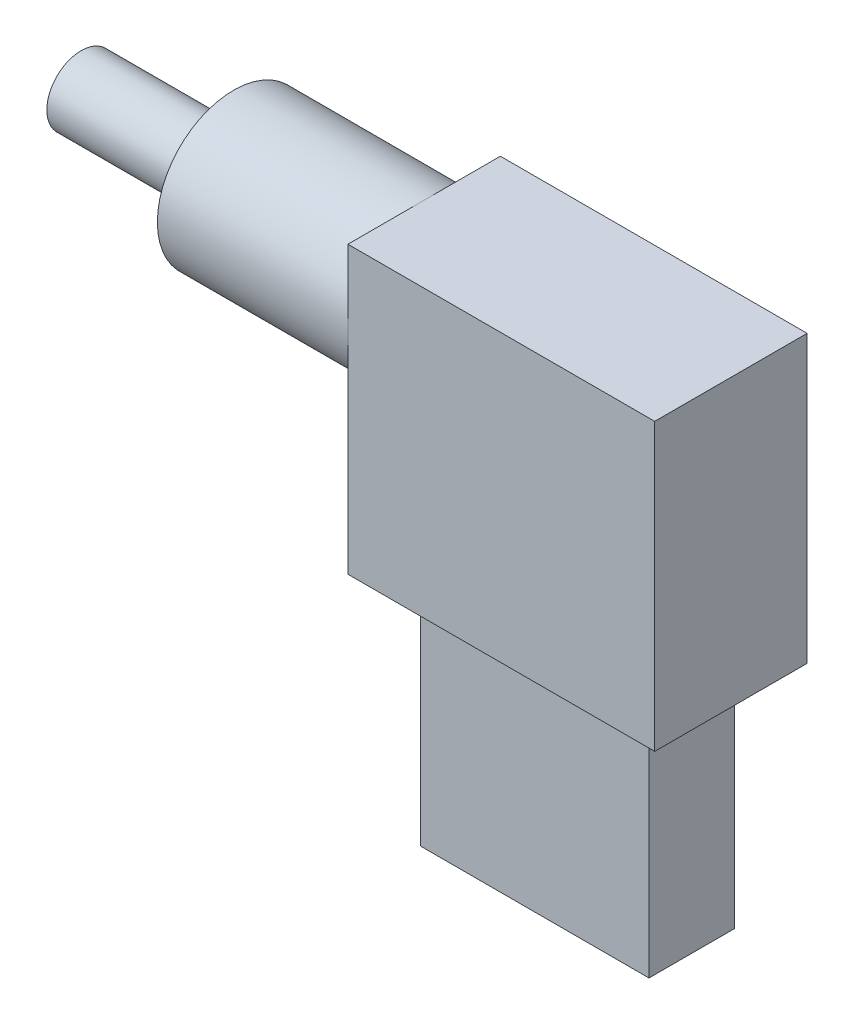
ISO-10303-21;
HEADER;
FILE_DESCRIPTION(('STEP AP214'),'2;1');
FILE_NAME('part.step','',(''),(''),'','','');
FILE_SCHEMA(('AUTOMOTIVE_DESIGN { 1 0 10303 214 1 1 1 1 }'));
ENDSEC;
DATA;
#1=APPLICATION_CONTEXT('core data for automotive mechanical design processes');
#2=APPLICATION_PROTOCOL_DEFINITION('international standard','automotive_design',2000,#1);
#3=PRODUCT_CONTEXT('',#1,'mechanical');
#4=PRODUCT('Part','Part','',(#3));
#5=PRODUCT_RELATED_PRODUCT_CATEGORY('part','',(#4));
#6=PRODUCT_DEFINITION_FORMATION('','',#4);
#7=PRODUCT_DEFINITION_CONTEXT('part definition',#1,'design');
#8=PRODUCT_DEFINITION('design','',#6,#7);
#9=PRODUCT_DEFINITION_SHAPE('','',#8);
#10=(LENGTH_UNIT() NAMED_UNIT(*) SI_UNIT(.MILLI.,.METRE.));
#11=(NAMED_UNIT(*) PLANE_ANGLE_UNIT() SI_UNIT($,.RADIAN.));
#12=(NAMED_UNIT(*) SI_UNIT($,.STERADIAN.) SOLID_ANGLE_UNIT());
#13=UNCERTAINTY_MEASURE_WITH_UNIT(LENGTH_MEASURE(1.E-05),#10,'distance_accuracy_value','');
#14=(GEOMETRIC_REPRESENTATION_CONTEXT(3) GLOBAL_UNCERTAINTY_ASSIGNED_CONTEXT((#13)) GLOBAL_UNIT_ASSIGNED_CONTEXT((#10,
#11,#12)) REPRESENTATION_CONTEXT('',''));
#15=CARTESIAN_POINT('',(0.,0.,0.));
#16=DIRECTION('',(0.,0.,1.));
#17=DIRECTION('',(1.,0.,0.));
#18=AXIS2_PLACEMENT_3D('',#15,#16,#17);
#19=CARTESIAN_POINT('',(-8.05,27.2,-4.));
#20=DIRECTION('',(1.,0.,0.));
#21=DIRECTION('',(0.,0.,-1.));
#22=AXIS2_PLACEMENT_3D('',#19,#20,#21);
#23=PLANE('',#22);
#24=CARTESIAN_POINT('',(-8.05,23.2,0.));
#25=DIRECTION('',(-1.,0.,0.));
#26=DIRECTION('',(0.,0.,1.));
#27=AXIS2_PLACEMENT_3D('',#24,#25,#26);
#28=CIRCLE('',#27,4.);
#29=CARTESIAN_POINT('',(-8.05,23.2,4.));
#30=VERTEX_POINT('',#29);
#31=CARTESIAN_POINT('',(-8.05,27.2,0.));
#32=VERTEX_POINT('',#31);
#33=EDGE_CURVE('E153',#30,#32,#28,.T.);
#34=ORIENTED_EDGE('',*,*,#33,.F.);
#35=DIRECTION('',(0.,-1.,0.));
#36=VECTOR('',#35,1.);
#37=CARTESIAN_POINT('',(-8.05,27.2,4.));
#38=LINE('',#37,#36);
#39=CARTESIAN_POINT('',(-8.05,27.2,4.));
#40=VERTEX_POINT('',#39);
#41=EDGE_CURVE('E137',#40,#30,#38,.T.);
#42=ORIENTED_EDGE('',*,*,#41,.F.);
#43=DIRECTION('',(0.,0.,1.));
#44=VECTOR('',#43,1.);
#45=CARTESIAN_POINT('',(-8.05,27.2,-4.));
#46=LINE('',#45,#44);
#47=EDGE_CURVE('E154',#32,#40,#46,.T.);
#48=ORIENTED_EDGE('',*,*,#47,.F.);
#49=EDGE_LOOP('',(#34,#42,#48));
#50=FACE_BOUND('',#49,.T.);
#51=ADVANCED_FACE('F35',(#50),#23,.F.);
#52=CARTESIAN_POINT('',(-8.05,23.2,-4.));
#53=VERTEX_POINT('',#52);
#54=EDGE_CURVE('E44',#32,#53,#28,.T.);
#55=ORIENTED_EDGE('',*,*,#54,.F.);
#56=CARTESIAN_POINT('',(-8.05,27.2,-4.));
#57=VERTEX_POINT('',#56);
#58=EDGE_CURVE('E166',#57,#32,#46,.T.);
#59=ORIENTED_EDGE('',*,*,#58,.F.);
#60=DIRECTION('',(0.,-1.,0.));
#61=VECTOR('',#60,1.);
#62=CARTESIAN_POINT('',(-8.05,27.2,-4.));
#63=LINE('',#62,#61);
#64=EDGE_CURVE('E182',#57,#53,#63,.T.);
#65=ORIENTED_EDGE('',*,*,#64,.T.);
#66=EDGE_LOOP('',(#55,#59,#65));
#67=FACE_BOUND('',#66,.T.);
#68=ADVANCED_FACE('F278',(#67),#23,.F.);
#69=CARTESIAN_POINT('',(-5.7,12.2,0.));
#70=DIRECTION('',(1.,0.,0.));
#71=DIRECTION('',(0.,0.,-1.));
#72=AXIS2_PLACEMENT_3D('',#69,#70,#71);
#73=PLANE('',#72);
#74=DIRECTION('',(0.,0.,1.));
#75=VECTOR('',#74,1.);
#76=CARTESIAN_POINT('',(-5.7,0.,0.));
#77=LINE('',#76,#75);
#78=CARTESIAN_POINT('',(-5.7,0.,-1.95));
#79=VERTEX_POINT('',#78);
#80=CARTESIAN_POINT('',(-5.7,0.,-0.0499999999999997));
#81=VERTEX_POINT('',#80);
#82=EDGE_CURVE('E222',#79,#81,#77,.T.);
#83=ORIENTED_EDGE('',*,*,#82,.F.);
#84=DIRECTION('',(0.,-1.,0.));
#85=VECTOR('',#84,1.);
#86=CARTESIAN_POINT('',(-5.7,12.2,-1.95));
#87=LINE('',#86,#85);
#88=CARTESIAN_POINT('',(-5.7,12.2,-1.95));
#89=VERTEX_POINT('',#88);
#90=EDGE_CURVE('E161',#89,#79,#87,.T.);
#91=ORIENTED_EDGE('',*,*,#90,.F.);
#92=DIRECTION('',(0.,0.,1.));
#93=VECTOR('',#92,1.);
#94=CARTESIAN_POINT('',(-5.7,12.2,0.));
#95=LINE('',#94,#93);
#96=CARTESIAN_POINT('',(-5.7,12.2,-0.0499999999999997));
#97=VERTEX_POINT('',#96);
#98=EDGE_CURVE('E201',#89,#97,#95,.T.);
#99=ORIENTED_EDGE('',*,*,#98,.T.);
#100=DIRECTION('',(0.,-1.,0.));
#101=VECTOR('',#100,1.);
#102=CARTESIAN_POINT('',(-5.7,12.2,-0.0499999999999997));
#103=LINE('',#102,#101);
#104=EDGE_CURVE('E233',#97,#81,#103,.T.);
#105=ORIENTED_EDGE('',*,*,#104,.T.);
#106=EDGE_LOOP('',(#83,#91,#99,#105));
#107=FACE_BOUND('',#106,.T.);
#108=ADVANCED_FACE('F294',(#107),#73,.T.);
#109=CARTESIAN_POINT('',(0.,12.2,-1.95));
#110=DIRECTION('',(0.,0.,-1.));
#111=DIRECTION('',(-1.,0.,0.));
#112=AXIS2_PLACEMENT_3D('',#109,#110,#111);
#113=PLANE('',#112);
#114=DIRECTION('',(1.,0.,0.));
#115=VECTOR('',#114,1.);
#116=CARTESIAN_POINT('',(0.,0.,-1.95));
#117=LINE('',#116,#115);
#118=CARTESIAN_POINT('',(5.7,0.,-1.95));
#119=VERTEX_POINT('',#118);
#120=EDGE_CURVE('E225',#79,#119,#117,.T.);
#121=ORIENTED_EDGE('',*,*,#120,.T.);
#122=DIRECTION('',(0.,-1.,0.));
#123=VECTOR('',#122,1.);
#124=CARTESIAN_POINT('',(5.7,12.2,-1.95));
#125=LINE('',#124,#123);
#126=CARTESIAN_POINT('',(5.7,12.2,-1.95));
#127=VERTEX_POINT('',#126);
#128=EDGE_CURVE('E162',#127,#119,#125,.T.);
#129=ORIENTED_EDGE('',*,*,#128,.F.);
#130=DIRECTION('',(1.,0.,0.));
#131=VECTOR('',#130,1.);
#132=CARTESIAN_POINT('',(0.,12.2,-1.95));
#133=LINE('',#132,#131);
#134=EDGE_CURVE('E204',#89,#127,#133,.T.);
#135=ORIENTED_EDGE('',*,*,#134,.F.);
#136=ORIENTED_EDGE('',*,*,#90,.T.);
#137=EDGE_LOOP('',(#121,#129,#135,#136));
#138=FACE_BOUND('',#137,.T.);
#139=ADVANCED_FACE('F361',(#138),#113,.F.);
#140=CARTESIAN_POINT('',(5.7,12.2,0.));
#141=DIRECTION('',(1.,0.,0.));
#142=DIRECTION('',(0.,0.,-1.));
#143=AXIS2_PLACEMENT_3D('',#140,#141,#142);
#144=PLANE('',#143);
#145=DIRECTION('',(0.,0.,1.));
#146=VECTOR('',#145,1.);
#147=CARTESIAN_POINT('',(5.7,0.,0.));
#148=LINE('',#147,#146);
#149=CARTESIAN_POINT('',(5.7,0.,-0.0499999999999997));
#150=VERTEX_POINT('',#149);
#151=EDGE_CURVE('E228',#119,#150,#148,.T.);
#152=ORIENTED_EDGE('',*,*,#151,.T.);
#153=DIRECTION('',(0.,-1.,0.));
#154=VECTOR('',#153,1.);
#155=CARTESIAN_POINT('',(5.7,12.2,-0.0499999999999997));
#156=LINE('',#155,#154);
#157=CARTESIAN_POINT('',(5.7,12.2,-0.0499999999999997));
#158=VERTEX_POINT('',#157);
#159=EDGE_CURVE('E235',#158,#150,#156,.T.);
#160=ORIENTED_EDGE('',*,*,#159,.F.);
#161=DIRECTION('',(0.,0.,1.));
#162=VECTOR('',#161,1.);
#163=CARTESIAN_POINT('',(5.7,12.2,0.));
#164=LINE('',#163,#162);
#165=EDGE_CURVE('E206',#127,#158,#164,.T.);
#166=ORIENTED_EDGE('',*,*,#165,.F.);
#167=ORIENTED_EDGE('',*,*,#128,.T.);
#168=EDGE_LOOP('',(#152,#160,#166,#167));
#169=FACE_BOUND('',#168,.T.);
#170=ADVANCED_FACE('F371',(#169),#144,.F.);
#171=CARTESIAN_POINT('',(6.,12.2,0.));
#172=DIRECTION('',(1.,0.,0.));
#173=DIRECTION('',(0.,0.,-1.));
#174=AXIS2_PLACEMENT_3D('',#171,#172,#173);
#175=PLANE('',#174);
#176=DIRECTION('',(0.,0.,1.));
#177=VECTOR('',#176,1.);
#178=CARTESIAN_POINT('',(6.,0.,0.));
#179=LINE('',#178,#177);
#180=CARTESIAN_POINT('',(6.,0.,-2.25));
#181=VERTEX_POINT('',#180);
#182=CARTESIAN_POINT('',(6.,0.,2.25));
#183=VERTEX_POINT('',#182);
#184=EDGE_CURVE('E145',#181,#183,#179,.T.);
#185=ORIENTED_EDGE('',*,*,#184,.F.);
#186=DIRECTION('',(0.,-1.,0.));
#187=VECTOR('',#186,1.);
#188=CARTESIAN_POINT('',(6.,12.2,-2.25));
#189=LINE('',#188,#187);
#190=CARTESIAN_POINT('',(6.,12.2,-2.25));
#191=VERTEX_POINT('',#190);
#192=EDGE_CURVE('E39',#191,#181,#189,.T.);
#193=ORIENTED_EDGE('',*,*,#192,.F.);
#194=DIRECTION('',(0.,0.,1.));
#195=VECTOR('',#194,1.);
#196=CARTESIAN_POINT('',(6.,12.2,0.));
#197=LINE('',#196,#195);
#198=CARTESIAN_POINT('',(6.,12.2,2.25));
#199=VERTEX_POINT('',#198);
#200=EDGE_CURVE('E189',#191,#199,#197,.T.);
#201=ORIENTED_EDGE('',*,*,#200,.T.);
#202=DIRECTION('',(0.,-1.,0.));
#203=VECTOR('',#202,1.);
#204=CARTESIAN_POINT('',(6.,12.2,2.25));
#205=LINE('',#204,#203);
#206=EDGE_CURVE('E211',#199,#183,#205,.T.);
#207=ORIENTED_EDGE('',*,*,#206,.T.);
#208=EDGE_LOOP('',(#185,#193,#201,#207));
#209=FACE_BOUND('',#208,.T.);
#210=ADVANCED_FACE('F37',(#209),#175,.T.);
#211=CARTESIAN_POINT('',(0.,12.2,-2.25));
#212=DIRECTION('',(0.,0.,-1.));
#213=DIRECTION('',(-1.,0.,0.));
#214=AXIS2_PLACEMENT_3D('',#211,#212,#213);
#215=PLANE('',#214);
#216=DIRECTION('',(1.,0.,0.));
#217=VECTOR('',#216,1.);
#218=CARTESIAN_POINT('',(0.,0.,-2.25));
#219=LINE('',#218,#217);
#220=CARTESIAN_POINT('',(-6.,0.,-2.25));
#221=VERTEX_POINT('',#220);
#222=EDGE_CURVE('E214',#221,#181,#219,.T.);
#223=ORIENTED_EDGE('',*,*,#222,.F.);
#224=DIRECTION('',(0.,-1.,0.));
#225=VECTOR('',#224,1.);
#226=CARTESIAN_POINT('',(-6.,12.2,-2.25));
#227=LINE('',#226,#225);
#228=CARTESIAN_POINT('',(-6.,12.2,-2.25));
#229=VERTEX_POINT('',#228);
#230=EDGE_CURVE('E242',#229,#221,#227,.T.);
#231=ORIENTED_EDGE('',*,*,#230,.F.);
#232=DIRECTION('',(1.,0.,0.));
#233=VECTOR('',#232,1.);
#234=CARTESIAN_POINT('',(0.,12.2,-2.25));
#235=LINE('',#234,#233);
#236=EDGE_CURVE('E191',#229,#191,#235,.T.);
#237=ORIENTED_EDGE('',*,*,#236,.T.);
#238=ORIENTED_EDGE('',*,*,#192,.T.);
#239=EDGE_LOOP('',(#223,#231,#237,#238));
#240=FACE_BOUND('',#239,.T.);
#241=ADVANCED_FACE('F249',(#240),#215,.T.);
#242=CARTESIAN_POINT('',(-6.,12.2,0.));
#243=DIRECTION('',(1.,0.,0.));
#244=DIRECTION('',(0.,0.,-1.));
#245=AXIS2_PLACEMENT_3D('',#242,#243,#244);
#246=PLANE('',#245);
#247=DIRECTION('',(0.,0.,1.));
#248=VECTOR('',#247,1.);
#249=CARTESIAN_POINT('',(-6.,0.,0.));
#250=LINE('',#249,#248);
#251=CARTESIAN_POINT('',(-6.,0.,2.25));
#252=VERTEX_POINT('',#251);
#253=EDGE_CURVE('E217',#221,#252,#250,.T.);
#254=ORIENTED_EDGE('',*,*,#253,.T.);
#255=DIRECTION('',(0.,-1.,0.));
#256=VECTOR('',#255,1.);
#257=CARTESIAN_POINT('',(-6.,12.2,2.25));
#258=LINE('',#257,#256);
#259=CARTESIAN_POINT('',(-6.,12.2,2.25));
#260=VERTEX_POINT('',#259);
#261=EDGE_CURVE('E240',#260,#252,#258,.T.);
#262=ORIENTED_EDGE('',*,*,#261,.F.);
#263=DIRECTION('',(0.,0.,1.));
#264=VECTOR('',#263,1.);
#265=CARTESIAN_POINT('',(-6.,12.2,0.));
#266=LINE('',#265,#264);
#267=EDGE_CURVE('E195',#229,#260,#266,.T.);
#268=ORIENTED_EDGE('',*,*,#267,.F.);
#269=ORIENTED_EDGE('',*,*,#230,.T.);
#270=EDGE_LOOP('',(#254,#262,#268,#269));
#271=FACE_BOUND('',#270,.T.);
#272=ADVANCED_FACE('F258',(#271),#246,.F.);
#273=CARTESIAN_POINT('',(0.,12.2,2.25));
#274=DIRECTION('',(0.,0.,-1.));
#275=DIRECTION('',(-1.,0.,0.));
#276=AXIS2_PLACEMENT_3D('',#273,#274,#275);
#277=PLANE('',#276);
#278=DIRECTION('',(1.,0.,0.));
#279=VECTOR('',#278,1.);
#280=CARTESIAN_POINT('',(0.,0.,2.25));
#281=LINE('',#280,#279);
#282=EDGE_CURVE('E219',#252,#183,#281,.T.);
#283=ORIENTED_EDGE('',*,*,#282,.T.);
#284=ORIENTED_EDGE('',*,*,#206,.F.);
#285=DIRECTION('',(1.,0.,0.));
#286=VECTOR('',#285,1.);
#287=CARTESIAN_POINT('',(0.,12.2,2.25));
#288=LINE('',#287,#286);
#289=EDGE_CURVE('E198',#260,#199,#288,.T.);
#290=ORIENTED_EDGE('',*,*,#289,.F.);
#291=ORIENTED_EDGE('',*,*,#261,.T.);
#292=EDGE_LOOP('',(#283,#284,#290,#291));
#293=FACE_BOUND('',#292,.T.);
#294=ADVANCED_FACE('F261',(#293),#277,.F.);
#295=CARTESIAN_POINT('',(0.,12.2,-0.0499999999999997));
#296=DIRECTION('',(0.,0.,-1.));
#297=DIRECTION('',(-1.,0.,0.));
#298=AXIS2_PLACEMENT_3D('',#295,#296,#297);
#299=PLANE('',#298);
#300=DIRECTION('',(1.,0.,0.));
#301=VECTOR('',#300,1.);
#302=CARTESIAN_POINT('',(0.,0.,-0.0499999999999997));
#303=LINE('',#302,#301);
#304=EDGE_CURVE('E192',#81,#150,#303,.T.);
#305=ORIENTED_EDGE('',*,*,#304,.F.);
#306=ORIENTED_EDGE('',*,*,#104,.F.);
#307=DIRECTION('',(1.,0.,0.));
#308=VECTOR('',#307,1.);
#309=CARTESIAN_POINT('',(0.,12.2,-0.0499999999999997));
#310=LINE('',#309,#308);
#311=EDGE_CURVE('E208',#97,#158,#310,.T.);
#312=ORIENTED_EDGE('',*,*,#311,.T.);
#313=ORIENTED_EDGE('',*,*,#159,.T.);
#314=EDGE_LOOP('',(#305,#306,#312,#313));
#315=FACE_BOUND('',#314,.T.);
#316=ADVANCED_FACE('F350',(#315),#299,.T.);
#317=CARTESIAN_POINT('',(0.,0.,0.));
#318=DIRECTION('',(0.,1.,0.));
#319=DIRECTION('',(0.,0.,1.));
#320=AXIS2_PLACEMENT_3D('',#317,#318,#319);
#321=PLANE('',#320);
#322=ORIENTED_EDGE('',*,*,#184,.T.);
#323=ORIENTED_EDGE('',*,*,#282,.F.);
#324=ORIENTED_EDGE('',*,*,#253,.F.);
#325=ORIENTED_EDGE('',*,*,#222,.T.);
#326=EDGE_LOOP('',(#322,#323,#324,#325));
#327=FACE_BOUND('',#326,.T.);
#328=ORIENTED_EDGE('',*,*,#82,.T.);
#329=ORIENTED_EDGE('',*,*,#304,.T.);
#330=ORIENTED_EDGE('',*,*,#151,.F.);
#331=ORIENTED_EDGE('',*,*,#120,.F.);
#332=EDGE_LOOP('',(#328,#329,#330,#331));
#333=FACE_BOUND('',#332,.T.);
#334=ADVANCED_FACE('F256',(#327,#333),#321,.F.);
#335=CARTESIAN_POINT('',(0.,12.2,0.));
#336=DIRECTION('',(0.,1.,0.));
#337=DIRECTION('',(0.,0.,1.));
#338=AXIS2_PLACEMENT_3D('',#335,#336,#337);
#339=PLANE('',#338);
#340=ORIENTED_EDGE('',*,*,#98,.F.);
#341=ORIENTED_EDGE('',*,*,#134,.T.);
#342=ORIENTED_EDGE('',*,*,#165,.T.);
#343=ORIENTED_EDGE('',*,*,#311,.F.);
#344=EDGE_LOOP('',(#340,#341,#342,#343));
#345=FACE_BOUND('',#344,.T.);
#346=ADVANCED_FACE('F266',(#345),#339,.F.);
#347=ORIENTED_EDGE('',*,*,#200,.F.);
#348=ORIENTED_EDGE('',*,*,#236,.F.);
#349=ORIENTED_EDGE('',*,*,#267,.T.);
#350=ORIENTED_EDGE('',*,*,#289,.T.);
#351=EDGE_LOOP('',(#347,#348,#349,#350));
#352=FACE_BOUND('',#351,.T.);
#353=DIRECTION('',(0.,0.,1.));
#354=VECTOR('',#353,1.);
#355=CARTESIAN_POINT('',(-8.05,12.2,-4.));
#356=LINE('',#355,#354);
#357=CARTESIAN_POINT('',(-8.05,12.2,-4.));
#358=VERTEX_POINT('',#357);
#359=CARTESIAN_POINT('',(-8.05,12.2,4.));
#360=VERTEX_POINT('',#359);
#361=EDGE_CURVE('E150',#358,#360,#356,.T.);
#362=ORIENTED_EDGE('',*,*,#361,.F.);
#363=DIRECTION('',(-1.,0.,0.));
#364=VECTOR('',#363,1.);
#365=CARTESIAN_POINT('',(-8.05,12.2,-4.));
#366=LINE('',#365,#364);
#367=CARTESIAN_POINT('',(8.05,12.2,-4.));
#368=VERTEX_POINT('',#367);
#369=EDGE_CURVE('E179',#368,#358,#366,.T.);
#370=ORIENTED_EDGE('',*,*,#369,.F.);
#371=DIRECTION('',(0.,0.,-1.));
#372=VECTOR('',#371,1.);
#373=CARTESIAN_POINT('',(8.05,12.2,-4.));
#374=LINE('',#373,#372);
#375=CARTESIAN_POINT('',(8.05,12.2,4.));
#376=VERTEX_POINT('',#375);
#377=EDGE_CURVE('E177',#376,#368,#374,.T.);
#378=ORIENTED_EDGE('',*,*,#377,.F.);
#379=DIRECTION('',(1.,0.,0.));
#380=VECTOR('',#379,1.);
#381=CARTESIAN_POINT('',(-8.05,12.2,4.));
#382=LINE('',#381,#380);
#383=EDGE_CURVE('E175',#360,#376,#382,.T.);
#384=ORIENTED_EDGE('',*,*,#383,.F.);
#385=EDGE_LOOP('',(#362,#370,#378,#384));
#386=FACE_BOUND('',#385,.T.);
#387=ADVANCED_FACE('F263',(#352,#386),#339,.F.);
#388=EDGE_CURVE('E52',#53,#30,#28,.T.);
#389=ORIENTED_EDGE('',*,*,#388,.F.);
#390=EDGE_CURVE('E173',#53,#358,#63,.T.);
#391=ORIENTED_EDGE('',*,*,#390,.T.);
#392=ORIENTED_EDGE('',*,*,#361,.T.);
#393=EDGE_CURVE('E139',#30,#360,#38,.T.);
#394=ORIENTED_EDGE('',*,*,#393,.F.);
#395=EDGE_LOOP('',(#389,#391,#392,#394));
#396=FACE_BOUND('',#395,.T.);
#397=ADVANCED_FACE('F148',(#396),#23,.F.);
#398=CARTESIAN_POINT('',(-8.05,27.2,4.));
#399=DIRECTION('',(0.,0.,-1.));
#400=DIRECTION('',(-1.,0.,0.));
#401=AXIS2_PLACEMENT_3D('',#398,#399,#400);
#402=PLANE('',#401);
#403=ORIENTED_EDGE('',*,*,#383,.T.);
#404=DIRECTION('',(0.,-1.,0.));
#405=VECTOR('',#404,1.);
#406=CARTESIAN_POINT('',(8.05,27.2,4.));
#407=LINE('',#406,#405);
#408=CARTESIAN_POINT('',(8.05,27.2,4.));
#409=VERTEX_POINT('',#408);
#410=EDGE_CURVE('E151',#409,#376,#407,.T.);
#411=ORIENTED_EDGE('',*,*,#410,.F.);
#412=DIRECTION('',(1.,0.,0.));
#413=VECTOR('',#412,1.);
#414=CARTESIAN_POINT('',(-8.05,27.2,4.));
#415=LINE('',#414,#413);
#416=EDGE_CURVE('E142',#40,#409,#415,.T.);
#417=ORIENTED_EDGE('',*,*,#416,.F.);
#418=ORIENTED_EDGE('',*,*,#41,.T.);
#419=ORIENTED_EDGE('',*,*,#393,.T.);
#420=EDGE_LOOP('',(#403,#411,#417,#418,#419));
#421=FACE_BOUND('',#420,.T.);
#422=ADVANCED_FACE('F138',(#421),#402,.F.);
#423=CARTESIAN_POINT('',(8.05,27.2,-4.));
#424=DIRECTION('',(-1.,0.,0.));
#425=DIRECTION('',(0.,0.,1.));
#426=AXIS2_PLACEMENT_3D('',#423,#424,#425);
#427=PLANE('',#426);
#428=ORIENTED_EDGE('',*,*,#377,.T.);
#429=DIRECTION('',(0.,-1.,0.));
#430=VECTOR('',#429,1.);
#431=CARTESIAN_POINT('',(8.05,27.2,-4.));
#432=LINE('',#431,#430);
#433=CARTESIAN_POINT('',(8.05,27.2,-4.));
#434=VERTEX_POINT('',#433);
#435=EDGE_CURVE('E184',#434,#368,#432,.T.);
#436=ORIENTED_EDGE('',*,*,#435,.F.);
#437=DIRECTION('',(0.,0.,-1.));
#438=VECTOR('',#437,1.);
#439=CARTESIAN_POINT('',(8.05,27.2,-4.));
#440=LINE('',#439,#438);
#441=EDGE_CURVE('E169',#409,#434,#440,.T.);
#442=ORIENTED_EDGE('',*,*,#441,.F.);
#443=ORIENTED_EDGE('',*,*,#410,.T.);
#444=EDGE_LOOP('',(#428,#436,#442,#443));
#445=FACE_BOUND('',#444,.T.);
#446=ADVANCED_FACE('F272',(#445),#427,.F.);
#447=CARTESIAN_POINT('',(-8.05,27.2,-4.));
#448=DIRECTION('',(0.,0.,1.));
#449=DIRECTION('',(1.,0.,0.));
#450=AXIS2_PLACEMENT_3D('',#447,#448,#449);
#451=PLANE('',#450);
#452=ORIENTED_EDGE('',*,*,#369,.T.);
#453=ORIENTED_EDGE('',*,*,#390,.F.);
#454=ORIENTED_EDGE('',*,*,#64,.F.);
#455=DIRECTION('',(-1.,0.,0.));
#456=VECTOR('',#455,1.);
#457=CARTESIAN_POINT('',(-8.05,27.2,-4.));
#458=LINE('',#457,#456);
#459=EDGE_CURVE('E171',#434,#57,#458,.T.);
#460=ORIENTED_EDGE('',*,*,#459,.F.);
#461=ORIENTED_EDGE('',*,*,#435,.T.);
#462=EDGE_LOOP('',(#452,#453,#454,#460,#461));
#463=FACE_BOUND('',#462,.T.);
#464=ADVANCED_FACE('F280',(#463),#451,.F.);
#465=CARTESIAN_POINT('',(0.,27.2,0.));
#466=DIRECTION('',(0.,1.,0.));
#467=DIRECTION('',(0.,0.,1.));
#468=AXIS2_PLACEMENT_3D('',#465,#466,#467);
#469=PLANE('',#468);
#470=ORIENTED_EDGE('',*,*,#58,.T.);
#471=ORIENTED_EDGE('',*,*,#47,.T.);
#472=ORIENTED_EDGE('',*,*,#416,.T.);
#473=ORIENTED_EDGE('',*,*,#441,.T.);
#474=ORIENTED_EDGE('',*,*,#459,.T.);
#475=EDGE_LOOP('',(#470,#471,#472,#473,#474));
#476=FACE_BOUND('',#475,.T.);
#477=ADVANCED_FACE('F276',(#476),#469,.T.);
#478=CARTESIAN_POINT('',(-18.05,23.2,0.));
#479=DIRECTION('',(1.,0.,0.));
#480=DIRECTION('',(0.,0.,-1.));
#481=AXIS2_PLACEMENT_3D('',#478,#479,#480);
#482=CYLINDRICAL_SURFACE('',#481,4.);
#483=CARTESIAN_POINT('',(-18.05,23.2,0.));
#484=DIRECTION('',(-1.,0.,0.));
#485=DIRECTION('',(0.,0.,1.));
#486=AXIS2_PLACEMENT_3D('',#483,#484,#485);
#487=CIRCLE('',#486,4.);
#488=CARTESIAN_POINT('',(-18.05,23.2,4.));
#489=VERTEX_POINT('',#488);
#490=EDGE_CURVE('E157',#489,#489,#487,.T.);
#491=ORIENTED_EDGE('',*,*,#490,.F.);
#492=EDGE_LOOP('',(#491));
#493=FACE_BOUND('',#492,.T.);
#494=ORIENTED_EDGE('',*,*,#33,.T.);
#495=ORIENTED_EDGE('',*,*,#54,.T.);
#496=ORIENTED_EDGE('',*,*,#388,.T.);
#497=EDGE_LOOP('',(#494,#495,#496));
#498=FACE_BOUND('',#497,.T.);
#499=ADVANCED_FACE('F160',(#493,#498),#482,.T.);
#500=CARTESIAN_POINT('',(-18.05,23.2,0.));
#501=DIRECTION('',(-1.,0.,0.));
#502=DIRECTION('',(0.,0.,1.));
#503=AXIS2_PLACEMENT_3D('',#500,#501,#502);
#504=PLANE('',#503);
#505=CARTESIAN_POINT('',(-18.05,23.2,0.));
#506=DIRECTION('',(-1.,0.,0.));
#507=DIRECTION('',(0.,0.,1.));
#508=AXIS2_PLACEMENT_3D('',#505,#506,#507);
#509=CIRCLE('',#508,1.8);
#510=CARTESIAN_POINT('',(-18.05,23.2,1.8));
#511=VERTEX_POINT('',#510);
#512=EDGE_CURVE('E11',#511,#511,#509,.T.);
#513=ORIENTED_EDGE('',*,*,#512,.F.);
#514=EDGE_LOOP('',(#513));
#515=FACE_BOUND('',#514,.T.);
#516=ORIENTED_EDGE('',*,*,#490,.T.);
#517=EDGE_LOOP('',(#516));
#518=FACE_BOUND('',#517,.T.);
#519=ADVANCED_FACE('F435',(#515,#518),#504,.T.);
#520=CARTESIAN_POINT('',(-26.05,23.2,0.));
#521=DIRECTION('',(1.,0.,0.));
#522=DIRECTION('',(0.,0.,-1.));
#523=AXIS2_PLACEMENT_3D('',#520,#521,#522);
#524=CYLINDRICAL_SURFACE('',#523,1.8);
#525=CARTESIAN_POINT('',(-26.05,23.2,0.));
#526=DIRECTION('',(-1.,0.,0.));
#527=DIRECTION('',(0.,0.,1.));
#528=AXIS2_PLACEMENT_3D('',#525,#526,#527);
#529=CIRCLE('',#528,1.8);
#530=CARTESIAN_POINT('',(-26.05,23.2,1.8));
#531=VERTEX_POINT('',#530);
#532=EDGE_CURVE('E158',#531,#531,#529,.T.);
#533=ORIENTED_EDGE('',*,*,#532,.F.);
#534=EDGE_LOOP('',(#533));
#535=FACE_BOUND('',#534,.T.);
#536=ORIENTED_EDGE('',*,*,#512,.T.);
#537=EDGE_LOOP('',(#536));
#538=FACE_BOUND('',#537,.T.);
#539=ADVANCED_FACE('F439',(#535,#538),#524,.T.);
#540=CARTESIAN_POINT('',(-26.05,23.2,0.));
#541=DIRECTION('',(-1.,0.,0.));
#542=DIRECTION('',(0.,0.,1.));
#543=AXIS2_PLACEMENT_3D('',#540,#541,#542);
#544=PLANE('',#543);
#545=ORIENTED_EDGE('',*,*,#532,.T.);
#546=EDGE_LOOP('',(#545));
#547=FACE_BOUND('',#546,.T.);
#548=ADVANCED_FACE('F443',(#547),#544,.T.);
#549=CLOSED_SHELL('',(#51,#68,#108,#139,#170,#210,#241,#272,#294,#316,#334,#346,#387,#397,#422,
#446,#464,#477,#499,#519,#539,#548));
#550=MANIFOLD_SOLID_BREP('B2',#549);
#551=ADVANCED_BREP_SHAPE_REPRESENTATION('',(#18,#550),#14);
#552=SHAPE_DEFINITION_REPRESENTATION(#9,#551);
ENDSEC;
END-ISO-10303-21;
